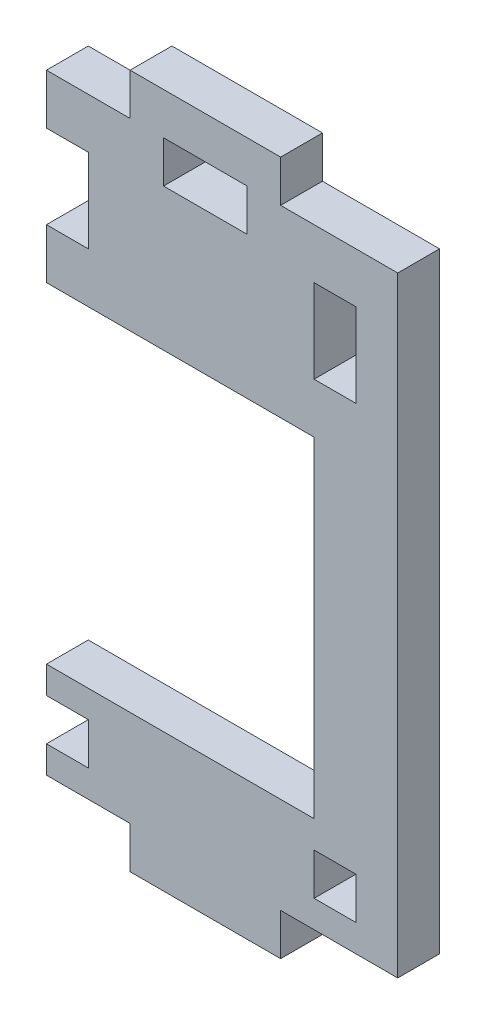
ISO-10303-21;
HEADER;
FILE_DESCRIPTION(('STEP AP214'),'2;1');
FILE_NAME('part.step','',(''),(''),'','','');
FILE_SCHEMA(('AUTOMOTIVE_DESIGN { 1 0 10303 214 1 1 1 1 }'));
ENDSEC;
DATA;
#1=APPLICATION_CONTEXT('core data for automotive mechanical design processes');
#2=APPLICATION_PROTOCOL_DEFINITION('international standard','automotive_design',2000,#1);
#3=PRODUCT_CONTEXT('',#1,'mechanical');
#4=PRODUCT('Part','Part','',(#3));
#5=PRODUCT_RELATED_PRODUCT_CATEGORY('part','',(#4));
#6=PRODUCT_DEFINITION_FORMATION('','',#4);
#7=PRODUCT_DEFINITION_CONTEXT('part definition',#1,'design');
#8=PRODUCT_DEFINITION('design','',#6,#7);
#9=PRODUCT_DEFINITION_SHAPE('','',#8);
#10=(LENGTH_UNIT() NAMED_UNIT(*) SI_UNIT(.MILLI.,.METRE.));
#11=(NAMED_UNIT(*) PLANE_ANGLE_UNIT() SI_UNIT($,.RADIAN.));
#12=(NAMED_UNIT(*) SI_UNIT($,.STERADIAN.) SOLID_ANGLE_UNIT());
#13=UNCERTAINTY_MEASURE_WITH_UNIT(LENGTH_MEASURE(1.E-05),#10,'distance_accuracy_value','');
#14=(GEOMETRIC_REPRESENTATION_CONTEXT(3) GLOBAL_UNCERTAINTY_ASSIGNED_CONTEXT((#13)) GLOBAL_UNIT_ASSIGNED_CONTEXT((#10,
#11,#12)) REPRESENTATION_CONTEXT('',''));
#15=CARTESIAN_POINT('',(0.,0.,0.));
#16=DIRECTION('',(0.,0.,1.));
#17=DIRECTION('',(1.,0.,0.));
#18=AXIS2_PLACEMENT_3D('',#15,#16,#17);
#19=CARTESIAN_POINT('',(42.,0.,5.));
#20=DIRECTION('',(0.,1.,0.));
#21=DIRECTION('',(0.,0.,1.));
#22=AXIS2_PLACEMENT_3D('',#19,#20,#21);
#23=PLANE('',#22);
#24=DIRECTION('',(0.,0.,1.));
#25=VECTOR('',#24,1.);
#26=CARTESIAN_POINT('',(28.,0.,0.));
#27=LINE('',#26,#25);
#28=CARTESIAN_POINT('',(28.,0.,0.));
#29=VERTEX_POINT('',#28);
#30=CARTESIAN_POINT('',(28.,0.,5.));
#31=VERTEX_POINT('',#30);
#32=EDGE_CURVE('E300',#29,#31,#27,.T.);
#33=ORIENTED_EDGE('',*,*,#32,.F.);
#34=DIRECTION('',(1.,0.,0.));
#35=VECTOR('',#34,1.);
#36=CARTESIAN_POINT('',(42.,0.,0.));
#37=LINE('',#36,#35);
#38=CARTESIAN_POINT('',(42.,0.,0.));
#39=VERTEX_POINT('',#38);
#40=EDGE_CURVE('E509',#29,#39,#37,.T.);
#41=ORIENTED_EDGE('',*,*,#40,.T.);
#42=DIRECTION('',(0.,0.,-1.));
#43=VECTOR('',#42,1.);
#44=CARTESIAN_POINT('',(42.,0.,5.));
#45=LINE('',#44,#43);
#46=CARTESIAN_POINT('',(42.,0.,5.));
#47=VERTEX_POINT('',#46);
#48=EDGE_CURVE('E531',#47,#39,#45,.T.);
#49=ORIENTED_EDGE('',*,*,#48,.F.);
#50=DIRECTION('',(1.,0.,0.));
#51=VECTOR('',#50,1.);
#52=CARTESIAN_POINT('',(42.,0.,5.));
#53=LINE('',#52,#51);
#54=EDGE_CURVE('E497',#31,#47,#53,.T.);
#55=ORIENTED_EDGE('',*,*,#54,.F.);
#56=EDGE_LOOP('',(#33,#41,#49,#55));
#57=FACE_BOUND('',#56,.T.);
#58=ADVANCED_FACE('F32',(#57),#23,.F.);
#59=CARTESIAN_POINT('',(0.,73.,5.));
#60=DIRECTION('',(0.,-1.,0.));
#61=DIRECTION('',(0.,0.,-1.));
#62=AXIS2_PLACEMENT_3D('',#59,#60,#61);
#63=PLANE('',#62);
#64=DIRECTION('',(-1.,0.,0.));
#65=VECTOR('',#64,1.);
#66=CARTESIAN_POINT('',(0.,73.,5.));
#67=LINE('',#66,#65);
#68=CARTESIAN_POINT('',(10.,73.,5.));
#69=VERTEX_POINT('',#68);
#70=CARTESIAN_POINT('',(0.,73.,5.));
#71=VERTEX_POINT('',#70);
#72=EDGE_CURVE('E565',#69,#71,#67,.T.);
#73=ORIENTED_EDGE('',*,*,#72,.F.);
#74=DIRECTION('',(0.,0.,1.));
#75=VECTOR('',#74,1.);
#76=CARTESIAN_POINT('',(10.,73.,0.));
#77=LINE('',#76,#75);
#78=CARTESIAN_POINT('',(10.,73.,0.));
#79=VERTEX_POINT('',#78);
#80=EDGE_CURVE('E321',#79,#69,#77,.T.);
#81=ORIENTED_EDGE('',*,*,#80,.F.);
#82=DIRECTION('',(-1.,0.,0.));
#83=VECTOR('',#82,1.);
#84=CARTESIAN_POINT('',(0.,73.,0.));
#85=LINE('',#84,#83);
#86=CARTESIAN_POINT('',(0.,73.,0.));
#87=VERTEX_POINT('',#86);
#88=EDGE_CURVE('E521',#79,#87,#85,.T.);
#89=ORIENTED_EDGE('',*,*,#88,.T.);
#90=DIRECTION('',(0.,0.,-1.));
#91=VECTOR('',#90,1.);
#92=CARTESIAN_POINT('',(0.,73.,5.));
#93=LINE('',#92,#91);
#94=EDGE_CURVE('E524',#71,#87,#93,.T.);
#95=ORIENTED_EDGE('',*,*,#94,.F.);
#96=EDGE_LOOP('',(#73,#81,#89,#95));
#97=FACE_BOUND('',#96,.T.);
#98=ADVANCED_FACE('F583',(#97),#63,.F.);
#99=CARTESIAN_POINT('',(0.,0.,5.));
#100=DIRECTION('',(1.,0.,0.));
#101=DIRECTION('',(0.,0.,-1.));
#102=AXIS2_PLACEMENT_3D('',#99,#100,#101);
#103=PLANE('',#102);
#104=DIRECTION('',(0.,-1.,0.));
#105=VECTOR('',#104,1.);
#106=CARTESIAN_POINT('',(0.,0.,0.));
#107=LINE('',#106,#105);
#108=CARTESIAN_POINT('',(0.,11.5,0.));
#109=VERTEX_POINT('',#108);
#110=CARTESIAN_POINT('',(0.,8.25,0.));
#111=VERTEX_POINT('',#110);
#112=EDGE_CURVE('E513',#109,#111,#107,.T.);
#113=ORIENTED_EDGE('',*,*,#112,.T.);
#114=DIRECTION('',(0.,0.,1.));
#115=VECTOR('',#114,1.);
#116=CARTESIAN_POINT('',(0.,8.25,0.));
#117=LINE('',#116,#115);
#118=CARTESIAN_POINT('',(0.,8.25,5.));
#119=VERTEX_POINT('',#118);
#120=EDGE_CURVE('E448',#111,#119,#117,.T.);
#121=ORIENTED_EDGE('',*,*,#120,.T.);
#122=DIRECTION('',(0.,-1.,0.));
#123=VECTOR('',#122,1.);
#124=CARTESIAN_POINT('',(0.,0.,5.));
#125=LINE('',#124,#123);
#126=CARTESIAN_POINT('',(0.,11.5,5.));
#127=VERTEX_POINT('',#126);
#128=EDGE_CURVE('E494',#127,#119,#125,.T.);
#129=ORIENTED_EDGE('',*,*,#128,.F.);
#130=DIRECTION('',(0.,0.,-1.));
#131=VECTOR('',#130,1.);
#132=CARTESIAN_POINT('',(0.,11.5,5.));
#133=LINE('',#132,#131);
#134=EDGE_CURVE('E537',#127,#109,#133,.T.);
#135=ORIENTED_EDGE('',*,*,#134,.T.);
#136=EDGE_LOOP('',(#113,#121,#129,#135));
#137=FACE_BOUND('',#136,.T.);
#138=ADVANCED_FACE('F593',(#137),#103,.F.);
#139=CARTESIAN_POINT('',(0.,51.,5.));
#140=DIRECTION('',(1.,0.,0.));
#141=DIRECTION('',(0.,0.,-1.));
#142=AXIS2_PLACEMENT_3D('',#139,#140,#141);
#143=PLANE('',#142);
#144=DIRECTION('',(0.,-1.,0.));
#145=VECTOR('',#144,1.);
#146=CARTESIAN_POINT('',(0.,51.,5.));
#147=LINE('',#146,#145);
#148=CARTESIAN_POINT('',(0.,57.,5.));
#149=VERTEX_POINT('',#148);
#150=CARTESIAN_POINT('',(0.,51.,5.));
#151=VERTEX_POINT('',#150);
#152=EDGE_CURVE('E487',#149,#151,#147,.T.);
#153=ORIENTED_EDGE('',*,*,#152,.F.);
#154=DIRECTION('',(0.,0.,1.));
#155=VECTOR('',#154,1.);
#156=CARTESIAN_POINT('',(0.,57.,0.));
#157=LINE('',#156,#155);
#158=CARTESIAN_POINT('',(0.,57.,0.));
#159=VERTEX_POINT('',#158);
#160=EDGE_CURVE('E477',#159,#149,#157,.T.);
#161=ORIENTED_EDGE('',*,*,#160,.F.);
#162=DIRECTION('',(0.,-1.,0.));
#163=VECTOR('',#162,1.);
#164=CARTESIAN_POINT('',(0.,51.,0.));
#165=LINE('',#164,#163);
#166=CARTESIAN_POINT('',(0.,51.,0.));
#167=VERTEX_POINT('',#166);
#168=EDGE_CURVE('E476',#159,#167,#165,.T.);
#169=ORIENTED_EDGE('',*,*,#168,.T.);
#170=DIRECTION('',(0.,0.,-1.));
#171=VECTOR('',#170,1.);
#172=CARTESIAN_POINT('',(0.,51.,5.));
#173=LINE('',#172,#171);
#174=EDGE_CURVE('E11',#151,#167,#173,.T.);
#175=ORIENTED_EDGE('',*,*,#174,.F.);
#176=EDGE_LOOP('',(#153,#161,#169,#175));
#177=FACE_BOUND('',#176,.T.);
#178=ADVANCED_FACE('F637',(#177),#143,.F.);
#179=CARTESIAN_POINT('',(0.,67.,0.));
#180=VERTEX_POINT('',#179);
#181=EDGE_CURVE('E561',#87,#180,#165,.T.);
#182=ORIENTED_EDGE('',*,*,#181,.T.);
#183=DIRECTION('',(0.,0.,1.));
#184=VECTOR('',#183,1.);
#185=CARTESIAN_POINT('',(0.,67.,0.));
#186=LINE('',#185,#184);
#187=CARTESIAN_POINT('',(0.,67.,5.));
#188=VERTEX_POINT('',#187);
#189=EDGE_CURVE('E479',#180,#188,#186,.T.);
#190=ORIENTED_EDGE('',*,*,#189,.T.);
#191=EDGE_CURVE('E483',#71,#188,#147,.T.);
#192=ORIENTED_EDGE('',*,*,#191,.F.);
#193=ORIENTED_EDGE('',*,*,#94,.T.);
#194=EDGE_LOOP('',(#182,#190,#192,#193));
#195=FACE_BOUND('',#194,.T.);
#196=ADVANCED_FACE('F34',(#195),#143,.F.);
#197=CARTESIAN_POINT('',(32.,51.,5.));
#198=DIRECTION('',(0.,1.,0.));
#199=DIRECTION('',(-1.,0.,0.));
#200=AXIS2_PLACEMENT_3D('',#197,#198,#199);
#201=PLANE('',#200);
#202=DIRECTION('',(1.,0.,0.));
#203=VECTOR('',#202,1.);
#204=CARTESIAN_POINT('',(32.,51.,0.));
#205=LINE('',#204,#203);
#206=CARTESIAN_POINT('',(32.,51.,0.));
#207=VERTEX_POINT('',#206);
#208=EDGE_CURVE('E556',#167,#207,#205,.T.);
#209=ORIENTED_EDGE('',*,*,#208,.T.);
#210=DIRECTION('',(0.,0.,-1.));
#211=VECTOR('',#210,1.);
#212=CARTESIAN_POINT('',(32.,51.,5.));
#213=LINE('',#212,#211);
#214=CARTESIAN_POINT('',(32.,51.,5.));
#215=VERTEX_POINT('',#214);
#216=EDGE_CURVE('E41',#215,#207,#213,.T.);
#217=ORIENTED_EDGE('',*,*,#216,.F.);
#218=DIRECTION('',(1.,0.,0.));
#219=VECTOR('',#218,1.);
#220=CARTESIAN_POINT('',(32.,51.,5.));
#221=LINE('',#220,#219);
#222=EDGE_CURVE('E486',#151,#215,#221,.T.);
#223=ORIENTED_EDGE('',*,*,#222,.F.);
#224=ORIENTED_EDGE('',*,*,#174,.T.);
#225=EDGE_LOOP('',(#209,#217,#223,#224));
#226=FACE_BOUND('',#225,.T.);
#227=ADVANCED_FACE('F631',(#226),#201,.F.);
#228=CARTESIAN_POINT('',(32.,11.5,5.));
#229=DIRECTION('',(1.,0.,0.));
#230=DIRECTION('',(0.,0.,-1.));
#231=AXIS2_PLACEMENT_3D('',#228,#229,#230);
#232=PLANE('',#231);
#233=DIRECTION('',(0.,-1.,0.));
#234=VECTOR('',#233,1.);
#235=CARTESIAN_POINT('',(32.,11.5,0.));
#236=LINE('',#235,#234);
#237=CARTESIAN_POINT('',(32.,11.5,0.));
#238=VERTEX_POINT('',#237);
#239=EDGE_CURVE('E550',#207,#238,#236,.T.);
#240=ORIENTED_EDGE('',*,*,#239,.T.);
#241=DIRECTION('',(0.,0.,-1.));
#242=VECTOR('',#241,1.);
#243=CARTESIAN_POINT('',(32.,11.5,5.));
#244=LINE('',#243,#242);
#245=CARTESIAN_POINT('',(32.,11.5,5.));
#246=VERTEX_POINT('',#245);
#247=EDGE_CURVE('E540',#246,#238,#244,.T.);
#248=ORIENTED_EDGE('',*,*,#247,.F.);
#249=DIRECTION('',(0.,-1.,0.));
#250=VECTOR('',#249,1.);
#251=CARTESIAN_POINT('',(32.,11.5,5.));
#252=LINE('',#251,#250);
#253=EDGE_CURVE('E489',#215,#246,#252,.T.);
#254=ORIENTED_EDGE('',*,*,#253,.F.);
#255=ORIENTED_EDGE('',*,*,#216,.T.);
#256=EDGE_LOOP('',(#240,#248,#254,#255));
#257=FACE_BOUND('',#256,.T.);
#258=ADVANCED_FACE('F548',(#257),#232,.F.);
#259=CARTESIAN_POINT('',(0.,11.5,5.));
#260=DIRECTION('',(0.,-1.,0.));
#261=DIRECTION('',(0.,0.,-1.));
#262=AXIS2_PLACEMENT_3D('',#259,#260,#261);
#263=PLANE('',#262);
#264=DIRECTION('',(-1.,0.,0.));
#265=VECTOR('',#264,1.);
#266=CARTESIAN_POINT('',(0.,11.5,0.));
#267=LINE('',#266,#265);
#268=EDGE_CURVE('E558',#238,#109,#267,.T.);
#269=ORIENTED_EDGE('',*,*,#268,.T.);
#270=ORIENTED_EDGE('',*,*,#134,.F.);
#271=DIRECTION('',(-1.,0.,0.));
#272=VECTOR('',#271,1.);
#273=CARTESIAN_POINT('',(0.,11.5,5.));
#274=LINE('',#273,#272);
#275=EDGE_CURVE('E491',#246,#127,#274,.T.);
#276=ORIENTED_EDGE('',*,*,#275,.F.);
#277=ORIENTED_EDGE('',*,*,#247,.T.);
#278=EDGE_LOOP('',(#269,#270,#276,#277));
#279=FACE_BOUND('',#278,.T.);
#280=ADVANCED_FACE('F608',(#279),#263,.F.);
#281=CARTESIAN_POINT('',(0.,3.25,5.));
#282=VERTEX_POINT('',#281);
#283=CARTESIAN_POINT('',(0.,0.,5.));
#284=VERTEX_POINT('',#283);
#285=EDGE_CURVE('E493',#282,#284,#125,.T.);
#286=ORIENTED_EDGE('',*,*,#285,.F.);
#287=DIRECTION('',(0.,0.,1.));
#288=VECTOR('',#287,1.);
#289=CARTESIAN_POINT('',(0.,3.25,0.));
#290=LINE('',#289,#288);
#291=CARTESIAN_POINT('',(0.,3.25,0.));
#292=VERTEX_POINT('',#291);
#293=EDGE_CURVE('E441',#292,#282,#290,.T.);
#294=ORIENTED_EDGE('',*,*,#293,.F.);
#295=CARTESIAN_POINT('',(0.,0.,0.));
#296=VERTEX_POINT('',#295);
#297=EDGE_CURVE('E560',#292,#296,#107,.T.);
#298=ORIENTED_EDGE('',*,*,#297,.T.);
#299=DIRECTION('',(0.,0.,-1.));
#300=VECTOR('',#299,1.);
#301=CARTESIAN_POINT('',(0.,0.,5.));
#302=LINE('',#301,#300);
#303=EDGE_CURVE('E534',#284,#296,#302,.T.);
#304=ORIENTED_EDGE('',*,*,#303,.F.);
#305=EDGE_LOOP('',(#286,#294,#298,#304));
#306=FACE_BOUND('',#305,.T.);
#307=ADVANCED_FACE('F603',(#306),#103,.F.);
#308=CARTESIAN_POINT('',(10.,0.,0.));
#309=VERTEX_POINT('',#308);
#310=EDGE_CURVE('E512',#296,#309,#37,.T.);
#311=ORIENTED_EDGE('',*,*,#310,.T.);
#312=DIRECTION('',(0.,0.,1.));
#313=VECTOR('',#312,1.);
#314=CARTESIAN_POINT('',(10.,0.,0.));
#315=LINE('',#314,#313);
#316=CARTESIAN_POINT('',(10.,0.,5.));
#317=VERTEX_POINT('',#316);
#318=EDGE_CURVE('E290',#309,#317,#315,.T.);
#319=ORIENTED_EDGE('',*,*,#318,.T.);
#320=EDGE_CURVE('E506',#284,#317,#53,.T.);
#321=ORIENTED_EDGE('',*,*,#320,.F.);
#322=ORIENTED_EDGE('',*,*,#303,.T.);
#323=EDGE_LOOP('',(#311,#319,#321,#322));
#324=FACE_BOUND('',#323,.T.);
#325=ADVANCED_FACE('F589',(#324),#23,.F.);
#326=CARTESIAN_POINT('',(42.,73.,5.));
#327=DIRECTION('',(-1.,0.,0.));
#328=DIRECTION('',(0.,-1.,0.));
#329=AXIS2_PLACEMENT_3D('',#326,#327,#328);
#330=PLANE('',#329);
#331=DIRECTION('',(0.,1.,0.));
#332=VECTOR('',#331,1.);
#333=CARTESIAN_POINT('',(42.,73.,0.));
#334=LINE('',#333,#332);
#335=CARTESIAN_POINT('',(42.,73.,0.));
#336=VERTEX_POINT('',#335);
#337=EDGE_CURVE('E518',#39,#336,#334,.T.);
#338=ORIENTED_EDGE('',*,*,#337,.T.);
#339=DIRECTION('',(0.,0.,-1.));
#340=VECTOR('',#339,1.);
#341=CARTESIAN_POINT('',(42.,73.,5.));
#342=LINE('',#341,#340);
#343=CARTESIAN_POINT('',(42.,73.,5.));
#344=VERTEX_POINT('',#343);
#345=EDGE_CURVE('E527',#344,#336,#342,.T.);
#346=ORIENTED_EDGE('',*,*,#345,.F.);
#347=DIRECTION('',(0.,1.,0.));
#348=VECTOR('',#347,1.);
#349=CARTESIAN_POINT('',(42.,73.,5.));
#350=LINE('',#349,#348);
#351=EDGE_CURVE('E500',#47,#344,#350,.T.);
#352=ORIENTED_EDGE('',*,*,#351,.F.);
#353=ORIENTED_EDGE('',*,*,#48,.T.);
#354=EDGE_LOOP('',(#338,#346,#352,#353));
#355=FACE_BOUND('',#354,.T.);
#356=ADVANCED_FACE('F577',(#355),#330,.F.);
#357=CARTESIAN_POINT('',(28.,73.,0.));
#358=VERTEX_POINT('',#357);
#359=EDGE_CURVE('E522',#336,#358,#85,.T.);
#360=ORIENTED_EDGE('',*,*,#359,.T.);
#361=DIRECTION('',(0.,0.,1.));
#362=VECTOR('',#361,1.);
#363=CARTESIAN_POINT('',(28.,73.,0.));
#364=LINE('',#363,#362);
#365=CARTESIAN_POINT('',(28.,73.,5.));
#366=VERTEX_POINT('',#365);
#367=EDGE_CURVE('E57',#358,#366,#364,.T.);
#368=ORIENTED_EDGE('',*,*,#367,.T.);
#369=EDGE_CURVE('E528',#344,#366,#67,.T.);
#370=ORIENTED_EDGE('',*,*,#369,.F.);
#371=ORIENTED_EDGE('',*,*,#345,.T.);
#372=EDGE_LOOP('',(#360,#368,#370,#371));
#373=FACE_BOUND('',#372,.T.);
#374=ADVANCED_FACE('F580',(#373),#63,.F.);
#375=CARTESIAN_POINT('',(0.,0.,5.));
#376=DIRECTION('',(0.,0.,-1.));
#377=DIRECTION('',(-1.,0.,0.));
#378=AXIS2_PLACEMENT_3D('',#375,#376,#377);
#379=PLANE('',#378);
#380=ORIENTED_EDGE('',*,*,#369,.T.);
#381=DIRECTION('',(0.,1.,0.));
#382=VECTOR('',#381,1.);
#383=CARTESIAN_POINT('',(28.,73.,5.));
#384=LINE('',#383,#382);
#385=CARTESIAN_POINT('',(28.,78.,5.));
#386=VERTEX_POINT('',#385);
#387=EDGE_CURVE('E328',#366,#386,#384,.T.);
#388=ORIENTED_EDGE('',*,*,#387,.T.);
#389=DIRECTION('',(-1.,0.,0.));
#390=VECTOR('',#389,1.);
#391=CARTESIAN_POINT('',(10.,78.,5.));
#392=LINE('',#391,#390);
#393=CARTESIAN_POINT('',(10.,78.,5.));
#394=VERTEX_POINT('',#393);
#395=EDGE_CURVE('E312',#386,#394,#392,.T.);
#396=ORIENTED_EDGE('',*,*,#395,.T.);
#397=DIRECTION('',(0.,-1.,0.));
#398=VECTOR('',#397,1.);
#399=CARTESIAN_POINT('',(10.,73.,5.));
#400=LINE('',#399,#398);
#401=EDGE_CURVE('E322',#394,#69,#400,.T.);
#402=ORIENTED_EDGE('',*,*,#401,.T.);
#403=ORIENTED_EDGE('',*,*,#72,.T.);
#404=ORIENTED_EDGE('',*,*,#191,.T.);
#405=DIRECTION('',(-1.,0.,0.));
#406=VECTOR('',#405,1.);
#407=CARTESIAN_POINT('',(4.99999999999999,67.,5.));
#408=LINE('',#407,#406);
#409=CARTESIAN_POINT('',(4.99999999999999,67.,5.));
#410=VERTEX_POINT('',#409);
#411=EDGE_CURVE('E470',#410,#188,#408,.T.);
#412=ORIENTED_EDGE('',*,*,#411,.F.);
#413=DIRECTION('',(0.,1.,0.));
#414=VECTOR('',#413,1.);
#415=CARTESIAN_POINT('',(4.99999999999999,67.,5.));
#416=LINE('',#415,#414);
#417=CARTESIAN_POINT('',(4.99999999999999,57.,5.));
#418=VERTEX_POINT('',#417);
#419=EDGE_CURVE('E451',#418,#410,#416,.T.);
#420=ORIENTED_EDGE('',*,*,#419,.F.);
#421=DIRECTION('',(1.,0.,0.));
#422=VECTOR('',#421,1.);
#423=CARTESIAN_POINT('',(4.99999999999999,57.,5.));
#424=LINE('',#423,#422);
#425=EDGE_CURVE('E461',#149,#418,#424,.T.);
#426=ORIENTED_EDGE('',*,*,#425,.F.);
#427=ORIENTED_EDGE('',*,*,#152,.T.);
#428=ORIENTED_EDGE('',*,*,#222,.T.);
#429=ORIENTED_EDGE('',*,*,#253,.T.);
#430=ORIENTED_EDGE('',*,*,#275,.T.);
#431=ORIENTED_EDGE('',*,*,#128,.T.);
#432=DIRECTION('',(-1.,0.,0.));
#433=VECTOR('',#432,1.);
#434=CARTESIAN_POINT('',(0.,8.25,5.));
#435=LINE('',#434,#433);
#436=CARTESIAN_POINT('',(4.99999999999999,8.25,5.));
#437=VERTEX_POINT('',#436);
#438=EDGE_CURVE('E435',#437,#119,#435,.T.);
#439=ORIENTED_EDGE('',*,*,#438,.F.);
#440=DIRECTION('',(0.,1.,0.));
#441=VECTOR('',#440,1.);
#442=CARTESIAN_POINT('',(4.99999999999999,8.25,5.));
#443=LINE('',#442,#441);
#444=CARTESIAN_POINT('',(4.99999999999999,3.25,5.));
#445=VERTEX_POINT('',#444);
#446=EDGE_CURVE('E444',#445,#437,#443,.T.);
#447=ORIENTED_EDGE('',*,*,#446,.F.);
#448=DIRECTION('',(1.,0.,0.));
#449=VECTOR('',#448,1.);
#450=CARTESIAN_POINT('',(0.,3.25,5.));
#451=LINE('',#450,#449);
#452=EDGE_CURVE('E424',#282,#445,#451,.T.);
#453=ORIENTED_EDGE('',*,*,#452,.F.);
#454=ORIENTED_EDGE('',*,*,#285,.T.);
#455=ORIENTED_EDGE('',*,*,#320,.T.);
#456=DIRECTION('',(0.,-1.,0.));
#457=VECTOR('',#456,1.);
#458=CARTESIAN_POINT('',(10.,0.,5.));
#459=LINE('',#458,#457);
#460=CARTESIAN_POINT('',(10.,-5.00000000000002,5.));
#461=VERTEX_POINT('',#460);
#462=EDGE_CURVE('E49',#317,#461,#459,.T.);
#463=ORIENTED_EDGE('',*,*,#462,.T.);
#464=DIRECTION('',(1.,0.,0.));
#465=VECTOR('',#464,1.);
#466=CARTESIAN_POINT('',(10.,-5.00000000000002,5.));
#467=LINE('',#466,#465);
#468=CARTESIAN_POINT('',(28.,-5.00000000000002,5.));
#469=VERTEX_POINT('',#468);
#470=EDGE_CURVE('E273',#461,#469,#467,.T.);
#471=ORIENTED_EDGE('',*,*,#470,.T.);
#472=DIRECTION('',(0.,1.,0.));
#473=VECTOR('',#472,1.);
#474=CARTESIAN_POINT('',(28.,0.,5.));
#475=LINE('',#474,#473);
#476=EDGE_CURVE('E291',#469,#31,#475,.T.);
#477=ORIENTED_EDGE('',*,*,#476,.T.);
#478=ORIENTED_EDGE('',*,*,#54,.T.);
#479=ORIENTED_EDGE('',*,*,#351,.T.);
#480=EDGE_LOOP('',(#380,#388,#396,#402,#403,#404,#412,#420,#426,#427,#428,#429,#430,#431,#439,
#447,#453,#454,#455,#463,#471,#477,#478,#479));
#481=FACE_BOUND('',#480,.T.);
#482=DIRECTION('',(1.,0.,0.));
#483=VECTOR('',#482,1.);
#484=CARTESIAN_POINT('',(32.,3.25,5.));
#485=LINE('',#484,#483);
#486=CARTESIAN_POINT('',(32.,3.25,5.));
#487=VERTEX_POINT('',#486);
#488=CARTESIAN_POINT('',(37.,3.25,5.));
#489=VERTEX_POINT('',#488);
#490=EDGE_CURVE('E382',#487,#489,#485,.T.);
#491=ORIENTED_EDGE('',*,*,#490,.F.);
#492=DIRECTION('',(0.,-1.,0.));
#493=VECTOR('',#492,1.);
#494=CARTESIAN_POINT('',(32.,8.25,5.));
#495=LINE('',#494,#493);
#496=CARTESIAN_POINT('',(32.,8.25,5.));
#497=VERTEX_POINT('',#496);
#498=EDGE_CURVE('E360',#497,#487,#495,.T.);
#499=ORIENTED_EDGE('',*,*,#498,.F.);
#500=DIRECTION('',(-1.,0.,0.));
#501=VECTOR('',#500,1.);
#502=CARTESIAN_POINT('',(32.,8.25,5.));
#503=LINE('',#502,#501);
#504=CARTESIAN_POINT('',(37.,8.25,5.));
#505=VERTEX_POINT('',#504);
#506=EDGE_CURVE('E371',#505,#497,#503,.T.);
#507=ORIENTED_EDGE('',*,*,#506,.F.);
#508=DIRECTION('',(0.,1.,0.));
#509=VECTOR('',#508,1.);
#510=CARTESIAN_POINT('',(37.,8.25,5.));
#511=LINE('',#510,#509);
#512=EDGE_CURVE('E385',#489,#505,#511,.T.);
#513=ORIENTED_EDGE('',*,*,#512,.F.);
#514=EDGE_LOOP('',(#491,#499,#507,#513));
#515=FACE_BOUND('',#514,.T.);
#516=DIRECTION('',(1.,0.,0.));
#517=VECTOR('',#516,1.);
#518=CARTESIAN_POINT('',(32.,57.,5.));
#519=LINE('',#518,#517);
#520=CARTESIAN_POINT('',(32.,57.,5.));
#521=VERTEX_POINT('',#520);
#522=CARTESIAN_POINT('',(37.,57.,5.));
#523=VERTEX_POINT('',#522);
#524=EDGE_CURVE('E414',#521,#523,#519,.T.);
#525=ORIENTED_EDGE('',*,*,#524,.F.);
#526=DIRECTION('',(0.,-1.,0.));
#527=VECTOR('',#526,1.);
#528=CARTESIAN_POINT('',(32.,67.,5.));
#529=LINE('',#528,#527);
#530=CARTESIAN_POINT('',(32.,67.,5.));
#531=VERTEX_POINT('',#530);
#532=EDGE_CURVE('E392',#531,#521,#529,.T.);
#533=ORIENTED_EDGE('',*,*,#532,.F.);
#534=DIRECTION('',(-1.,0.,0.));
#535=VECTOR('',#534,1.);
#536=CARTESIAN_POINT('',(32.,67.,5.));
#537=LINE('',#536,#535);
#538=CARTESIAN_POINT('',(37.,67.,5.));
#539=VERTEX_POINT('',#538);
#540=EDGE_CURVE('E403',#539,#531,#537,.T.);
#541=ORIENTED_EDGE('',*,*,#540,.F.);
#542=DIRECTION('',(0.,1.,0.));
#543=VECTOR('',#542,1.);
#544=CARTESIAN_POINT('',(37.,67.,5.));
#545=LINE('',#544,#543);
#546=EDGE_CURVE('E417',#523,#539,#545,.T.);
#547=ORIENTED_EDGE('',*,*,#546,.F.);
#548=EDGE_LOOP('',(#525,#533,#541,#547));
#549=FACE_BOUND('',#548,.T.);
#550=DIRECTION('',(1.,0.,0.));
#551=VECTOR('',#550,1.);
#552=CARTESIAN_POINT('',(14.000000000002,67.9999999999999,5.));
#553=LINE('',#552,#551);
#554=CARTESIAN_POINT('',(14.000000000002,67.9999999999999,5.));
#555=VERTEX_POINT('',#554);
#556=CARTESIAN_POINT('',(24.000000000002,67.9999999999999,5.));
#557=VERTEX_POINT('',#556);
#558=EDGE_CURVE('E353',#555,#557,#553,.T.);
#559=ORIENTED_EDGE('',*,*,#558,.F.);
#560=DIRECTION('',(0.,-1.,0.));
#561=VECTOR('',#560,1.);
#562=CARTESIAN_POINT('',(14.000000000002,73.,5.));
#563=LINE('',#562,#561);
#564=CARTESIAN_POINT('',(14.000000000002,73.,5.));
#565=VERTEX_POINT('',#564);
#566=EDGE_CURVE('E335',#565,#555,#563,.T.);
#567=ORIENTED_EDGE('',*,*,#566,.F.);
#568=DIRECTION('',(1.,0.,0.));
#569=VECTOR('',#568,1.);
#570=CARTESIAN_POINT('',(10.,73.,5.));
#571=LINE('',#570,#569);
#572=CARTESIAN_POINT('',(24.000000000002,73.,5.));
#573=VERTEX_POINT('',#572);
#574=EDGE_CURVE('E325',#565,#573,#571,.T.);
#575=ORIENTED_EDGE('',*,*,#574,.T.);
#576=DIRECTION('',(0.,1.,0.));
#577=VECTOR('',#576,1.);
#578=CARTESIAN_POINT('',(24.000000000002,73.,5.));
#579=LINE('',#578,#577);
#580=EDGE_CURVE('E344',#557,#573,#579,.T.);
#581=ORIENTED_EDGE('',*,*,#580,.F.);
#582=EDGE_LOOP('',(#559,#567,#575,#581));
#583=FACE_BOUND('',#582,.T.);
#584=ADVANCED_FACE('F572',(#481,#515,#549,#583),#379,.F.);
#585=CARTESIAN_POINT('',(0.,0.,0.));
#586=DIRECTION('',(0.,0.,-1.));
#587=DIRECTION('',(-1.,0.,0.));
#588=AXIS2_PLACEMENT_3D('',#585,#586,#587);
#589=PLANE('',#588);
#590=DIRECTION('',(0.,1.,0.));
#591=VECTOR('',#590,1.);
#592=CARTESIAN_POINT('',(28.,73.,0.));
#593=LINE('',#592,#591);
#594=CARTESIAN_POINT('',(28.,78.,0.));
#595=VERTEX_POINT('',#594);
#596=EDGE_CURVE('E315',#358,#595,#593,.T.);
#597=ORIENTED_EDGE('',*,*,#596,.F.);
#598=ORIENTED_EDGE('',*,*,#359,.F.);
#599=ORIENTED_EDGE('',*,*,#337,.F.);
#600=ORIENTED_EDGE('',*,*,#40,.F.);
#601=DIRECTION('',(0.,1.,0.));
#602=VECTOR('',#601,1.);
#603=CARTESIAN_POINT('',(28.,0.,0.));
#604=LINE('',#603,#602);
#605=CARTESIAN_POINT('',(28.,-5.00000000000002,0.));
#606=VERTEX_POINT('',#605);
#607=EDGE_CURVE('E276',#606,#29,#604,.T.);
#608=ORIENTED_EDGE('',*,*,#607,.F.);
#609=DIRECTION('',(1.,0.,0.));
#610=VECTOR('',#609,1.);
#611=CARTESIAN_POINT('',(10.,-5.00000000000002,0.));
#612=LINE('',#611,#610);
#613=CARTESIAN_POINT('',(10.,-5.00000000000002,0.));
#614=VERTEX_POINT('',#613);
#615=EDGE_CURVE('E271',#614,#606,#612,.T.);
#616=ORIENTED_EDGE('',*,*,#615,.F.);
#617=DIRECTION('',(0.,-1.,0.));
#618=VECTOR('',#617,1.);
#619=CARTESIAN_POINT('',(10.,0.,0.));
#620=LINE('',#619,#618);
#621=EDGE_CURVE('E285',#309,#614,#620,.T.);
#622=ORIENTED_EDGE('',*,*,#621,.F.);
#623=ORIENTED_EDGE('',*,*,#310,.F.);
#624=ORIENTED_EDGE('',*,*,#297,.F.);
#625=DIRECTION('',(1.,0.,0.));
#626=VECTOR('',#625,1.);
#627=CARTESIAN_POINT('',(0.,3.25,0.));
#628=LINE('',#627,#626);
#629=CARTESIAN_POINT('',(4.99999999999999,3.25,0.));
#630=VERTEX_POINT('',#629);
#631=EDGE_CURVE('E431',#292,#630,#628,.T.);
#632=ORIENTED_EDGE('',*,*,#631,.T.);
#633=DIRECTION('',(0.,1.,0.));
#634=VECTOR('',#633,1.);
#635=CARTESIAN_POINT('',(4.99999999999999,8.25,0.));
#636=LINE('',#635,#634);
#637=CARTESIAN_POINT('',(4.99999999999999,8.25,0.));
#638=VERTEX_POINT('',#637);
#639=EDGE_CURVE('E434',#630,#638,#636,.T.);
#640=ORIENTED_EDGE('',*,*,#639,.T.);
#641=DIRECTION('',(-1.,0.,0.));
#642=VECTOR('',#641,1.);
#643=CARTESIAN_POINT('',(0.,8.25,0.));
#644=LINE('',#643,#642);
#645=EDGE_CURVE('E438',#638,#111,#644,.T.);
#646=ORIENTED_EDGE('',*,*,#645,.T.);
#647=ORIENTED_EDGE('',*,*,#112,.F.);
#648=ORIENTED_EDGE('',*,*,#268,.F.);
#649=ORIENTED_EDGE('',*,*,#239,.F.);
#650=ORIENTED_EDGE('',*,*,#208,.F.);
#651=ORIENTED_EDGE('',*,*,#168,.F.);
#652=DIRECTION('',(1.,0.,0.));
#653=VECTOR('',#652,1.);
#654=CARTESIAN_POINT('',(4.99999999999999,57.,0.));
#655=LINE('',#654,#653);
#656=CARTESIAN_POINT('',(4.99999999999999,57.,0.));
#657=VERTEX_POINT('',#656);
#658=EDGE_CURVE('E464',#159,#657,#655,.T.);
#659=ORIENTED_EDGE('',*,*,#658,.T.);
#660=DIRECTION('',(0.,1.,0.));
#661=VECTOR('',#660,1.);
#662=CARTESIAN_POINT('',(4.99999999999999,67.,0.));
#663=LINE('',#662,#661);
#664=CARTESIAN_POINT('',(4.99999999999999,67.,0.));
#665=VERTEX_POINT('',#664);
#666=EDGE_CURVE('E457',#657,#665,#663,.T.);
#667=ORIENTED_EDGE('',*,*,#666,.T.);
#668=DIRECTION('',(-1.,0.,0.));
#669=VECTOR('',#668,1.);
#670=CARTESIAN_POINT('',(4.99999999999999,67.,0.));
#671=LINE('',#670,#669);
#672=EDGE_CURVE('E460',#665,#180,#671,.T.);
#673=ORIENTED_EDGE('',*,*,#672,.T.);
#674=ORIENTED_EDGE('',*,*,#181,.F.);
#675=ORIENTED_EDGE('',*,*,#88,.F.);
#676=DIRECTION('',(0.,-1.,0.));
#677=VECTOR('',#676,1.);
#678=CARTESIAN_POINT('',(10.,73.,0.));
#679=LINE('',#678,#677);
#680=CARTESIAN_POINT('',(10.,78.,0.));
#681=VERTEX_POINT('',#680);
#682=EDGE_CURVE('E309',#681,#79,#679,.T.);
#683=ORIENTED_EDGE('',*,*,#682,.F.);
#684=DIRECTION('',(-1.,0.,0.));
#685=VECTOR('',#684,1.);
#686=CARTESIAN_POINT('',(10.,78.,0.));
#687=LINE('',#686,#685);
#688=EDGE_CURVE('E318',#595,#681,#687,.T.);
#689=ORIENTED_EDGE('',*,*,#688,.F.);
#690=EDGE_LOOP('',(#597,#598,#599,#600,#608,#616,#622,#623,#624,#632,#640,#646,#647,#648,#649,
#650,#651,#659,#667,#673,#674,#675,#683,#689));
#691=FACE_BOUND('',#690,.T.);
#692=DIRECTION('',(0.,-1.,0.));
#693=VECTOR('',#692,1.);
#694=CARTESIAN_POINT('',(14.000000000002,73.,0.));
#695=LINE('',#694,#693);
#696=CARTESIAN_POINT('',(14.000000000002,73.,0.));
#697=VERTEX_POINT('',#696);
#698=CARTESIAN_POINT('',(14.000000000002,67.9999999999999,0.));
#699=VERTEX_POINT('',#698);
#700=EDGE_CURVE('E340',#697,#699,#695,.T.);
#701=ORIENTED_EDGE('',*,*,#700,.T.);
#702=DIRECTION('',(1.,0.,0.));
#703=VECTOR('',#702,1.);
#704=CARTESIAN_POINT('',(14.000000000002,67.9999999999999,0.));
#705=LINE('',#704,#703);
#706=CARTESIAN_POINT('',(24.000000000002,67.9999999999999,0.));
#707=VERTEX_POINT('',#706);
#708=EDGE_CURVE('E343',#699,#707,#705,.T.);
#709=ORIENTED_EDGE('',*,*,#708,.T.);
#710=DIRECTION('',(0.,1.,0.));
#711=VECTOR('',#710,1.);
#712=CARTESIAN_POINT('',(24.000000000002,73.,0.));
#713=LINE('',#712,#711);
#714=CARTESIAN_POINT('',(24.000000000002,73.,0.));
#715=VERTEX_POINT('',#714);
#716=EDGE_CURVE('E347',#707,#715,#713,.T.);
#717=ORIENTED_EDGE('',*,*,#716,.T.);
#718=DIRECTION('',(1.,0.,0.));
#719=VECTOR('',#718,1.);
#720=CARTESIAN_POINT('',(10.,73.,0.));
#721=LINE('',#720,#719);
#722=EDGE_CURVE('E311',#697,#715,#721,.T.);
#723=ORIENTED_EDGE('',*,*,#722,.F.);
#724=EDGE_LOOP('',(#701,#709,#717,#723));
#725=FACE_BOUND('',#724,.T.);
#726=DIRECTION('',(0.,-1.,0.));
#727=VECTOR('',#726,1.);
#728=CARTESIAN_POINT('',(32.,8.25,0.));
#729=LINE('',#728,#727);
#730=CARTESIAN_POINT('',(32.,8.25,0.));
#731=VERTEX_POINT('',#730);
#732=CARTESIAN_POINT('',(32.,3.25,0.));
#733=VERTEX_POINT('',#732);
#734=EDGE_CURVE('E367',#731,#733,#729,.T.);
#735=ORIENTED_EDGE('',*,*,#734,.T.);
#736=DIRECTION('',(1.,0.,0.));
#737=VECTOR('',#736,1.);
#738=CARTESIAN_POINT('',(32.,3.25,0.));
#739=LINE('',#738,#737);
#740=CARTESIAN_POINT('',(37.,3.25,0.));
#741=VERTEX_POINT('',#740);
#742=EDGE_CURVE('E370',#733,#741,#739,.T.);
#743=ORIENTED_EDGE('',*,*,#742,.T.);
#744=DIRECTION('',(0.,1.,0.));
#745=VECTOR('',#744,1.);
#746=CARTESIAN_POINT('',(37.,8.25,0.));
#747=LINE('',#746,#745);
#748=CARTESIAN_POINT('',(37.,8.25,0.));
#749=VERTEX_POINT('',#748);
#750=EDGE_CURVE('E374',#741,#749,#747,.T.);
#751=ORIENTED_EDGE('',*,*,#750,.T.);
#752=DIRECTION('',(-1.,0.,0.));
#753=VECTOR('',#752,1.);
#754=CARTESIAN_POINT('',(32.,8.25,0.));
#755=LINE('',#754,#753);
#756=EDGE_CURVE('E377',#749,#731,#755,.T.);
#757=ORIENTED_EDGE('',*,*,#756,.T.);
#758=EDGE_LOOP('',(#735,#743,#751,#757));
#759=FACE_BOUND('',#758,.T.);
#760=DIRECTION('',(0.,-1.,0.));
#761=VECTOR('',#760,1.);
#762=CARTESIAN_POINT('',(32.,67.,0.));
#763=LINE('',#762,#761);
#764=CARTESIAN_POINT('',(32.,67.,0.));
#765=VERTEX_POINT('',#764);
#766=CARTESIAN_POINT('',(32.,57.,0.));
#767=VERTEX_POINT('',#766);
#768=EDGE_CURVE('E399',#765,#767,#763,.T.);
#769=ORIENTED_EDGE('',*,*,#768,.T.);
#770=DIRECTION('',(1.,0.,0.));
#771=VECTOR('',#770,1.);
#772=CARTESIAN_POINT('',(32.,57.,0.));
#773=LINE('',#772,#771);
#774=CARTESIAN_POINT('',(37.,57.,0.));
#775=VERTEX_POINT('',#774);
#776=EDGE_CURVE('E402',#767,#775,#773,.T.);
#777=ORIENTED_EDGE('',*,*,#776,.T.);
#778=DIRECTION('',(0.,1.,0.));
#779=VECTOR('',#778,1.);
#780=CARTESIAN_POINT('',(37.,67.,0.));
#781=LINE('',#780,#779);
#782=CARTESIAN_POINT('',(37.,67.,0.));
#783=VERTEX_POINT('',#782);
#784=EDGE_CURVE('E406',#775,#783,#781,.T.);
#785=ORIENTED_EDGE('',*,*,#784,.T.);
#786=DIRECTION('',(-1.,0.,0.));
#787=VECTOR('',#786,1.);
#788=CARTESIAN_POINT('',(32.,67.,0.));
#789=LINE('',#788,#787);
#790=EDGE_CURVE('E409',#783,#765,#789,.T.);
#791=ORIENTED_EDGE('',*,*,#790,.T.);
#792=EDGE_LOOP('',(#769,#777,#785,#791));
#793=FACE_BOUND('',#792,.T.);
#794=ADVANCED_FACE('F282',(#691,#725,#759,#793),#589,.T.);
#795=CARTESIAN_POINT('',(4.99999999999999,67.,0.));
#796=DIRECTION('',(1.,0.,0.));
#797=DIRECTION('',(0.,1.,0.));
#798=AXIS2_PLACEMENT_3D('',#795,#796,#797);
#799=PLANE('',#798);
#800=ORIENTED_EDGE('',*,*,#419,.T.);
#801=DIRECTION('',(0.,0.,1.));
#802=VECTOR('',#801,1.);
#803=CARTESIAN_POINT('',(4.99999999999999,67.,0.));
#804=LINE('',#803,#802);
#805=EDGE_CURVE('E467',#665,#410,#804,.T.);
#806=ORIENTED_EDGE('',*,*,#805,.F.);
#807=ORIENTED_EDGE('',*,*,#666,.F.);
#808=DIRECTION('',(0.,0.,1.));
#809=VECTOR('',#808,1.);
#810=CARTESIAN_POINT('',(4.99999999999999,57.,0.));
#811=LINE('',#810,#809);
#812=EDGE_CURVE('E474',#657,#418,#811,.T.);
#813=ORIENTED_EDGE('',*,*,#812,.T.);
#814=EDGE_LOOP('',(#800,#806,#807,#813));
#815=FACE_BOUND('',#814,.T.);
#816=ADVANCED_FACE('F649',(#815),#799,.F.);
#817=CARTESIAN_POINT('',(4.99999999999999,57.,0.));
#818=DIRECTION('',(0.,-1.,0.));
#819=DIRECTION('',(0.,0.,-1.));
#820=AXIS2_PLACEMENT_3D('',#817,#818,#819);
#821=PLANE('',#820);
#822=ORIENTED_EDGE('',*,*,#425,.T.);
#823=ORIENTED_EDGE('',*,*,#812,.F.);
#824=ORIENTED_EDGE('',*,*,#658,.F.);
#825=ORIENTED_EDGE('',*,*,#160,.T.);
#826=EDGE_LOOP('',(#822,#823,#824,#825));
#827=FACE_BOUND('',#826,.T.);
#828=ADVANCED_FACE('F645',(#827),#821,.F.);
#829=CARTESIAN_POINT('',(4.99999999999999,67.,0.));
#830=DIRECTION('',(0.,1.,0.));
#831=DIRECTION('',(-1.,0.,0.));
#832=AXIS2_PLACEMENT_3D('',#829,#830,#831);
#833=PLANE('',#832);
#834=ORIENTED_EDGE('',*,*,#411,.T.);
#835=ORIENTED_EDGE('',*,*,#189,.F.);
#836=ORIENTED_EDGE('',*,*,#672,.F.);
#837=ORIENTED_EDGE('',*,*,#805,.T.);
#838=EDGE_LOOP('',(#834,#835,#836,#837));
#839=FACE_BOUND('',#838,.T.);
#840=ADVANCED_FACE('F653',(#839),#833,.F.);
#841=CARTESIAN_POINT('',(0.,8.25,0.));
#842=DIRECTION('',(0.,1.,0.));
#843=DIRECTION('',(0.,0.,1.));
#844=AXIS2_PLACEMENT_3D('',#841,#842,#843);
#845=PLANE('',#844);
#846=ORIENTED_EDGE('',*,*,#438,.T.);
#847=ORIENTED_EDGE('',*,*,#120,.F.);
#848=ORIENTED_EDGE('',*,*,#645,.F.);
#849=DIRECTION('',(0.,0.,1.));
#850=VECTOR('',#849,1.);
#851=CARTESIAN_POINT('',(4.99999999999999,8.25,0.));
#852=LINE('',#851,#850);
#853=EDGE_CURVE('E452',#638,#437,#852,.T.);
#854=ORIENTED_EDGE('',*,*,#853,.T.);
#855=EDGE_LOOP('',(#846,#847,#848,#854));
#856=FACE_BOUND('',#855,.T.);
#857=ADVANCED_FACE('F620',(#856),#845,.F.);
#858=CARTESIAN_POINT('',(4.99999999999999,8.25,0.));
#859=DIRECTION('',(1.,0.,0.));
#860=DIRECTION('',(0.,0.,-1.));
#861=AXIS2_PLACEMENT_3D('',#858,#859,#860);
#862=PLANE('',#861);
#863=ORIENTED_EDGE('',*,*,#446,.T.);
#864=ORIENTED_EDGE('',*,*,#853,.F.);
#865=ORIENTED_EDGE('',*,*,#639,.F.);
#866=DIRECTION('',(0.,0.,1.));
#867=VECTOR('',#866,1.);
#868=CARTESIAN_POINT('',(4.99999999999999,3.25,0.));
#869=LINE('',#868,#867);
#870=EDGE_CURVE('E454',#630,#445,#869,.T.);
#871=ORIENTED_EDGE('',*,*,#870,.T.);
#872=EDGE_LOOP('',(#863,#864,#865,#871));
#873=FACE_BOUND('',#872,.T.);
#874=ADVANCED_FACE('F676',(#873),#862,.F.);
#875=CARTESIAN_POINT('',(0.,3.25,0.));
#876=DIRECTION('',(0.,-1.,0.));
#877=DIRECTION('',(0.,0.,-1.));
#878=AXIS2_PLACEMENT_3D('',#875,#876,#877);
#879=PLANE('',#878);
#880=ORIENTED_EDGE('',*,*,#452,.T.);
#881=ORIENTED_EDGE('',*,*,#870,.F.);
#882=ORIENTED_EDGE('',*,*,#631,.F.);
#883=ORIENTED_EDGE('',*,*,#293,.T.);
#884=EDGE_LOOP('',(#880,#881,#882,#883));
#885=FACE_BOUND('',#884,.T.);
#886=ADVANCED_FACE('F673',(#885),#879,.F.);
#887=CARTESIAN_POINT('',(32.,67.,0.));
#888=DIRECTION('',(-1.,0.,0.));
#889=DIRECTION('',(0.,0.,1.));
#890=AXIS2_PLACEMENT_3D('',#887,#888,#889);
#891=PLANE('',#890);
#892=ORIENTED_EDGE('',*,*,#532,.T.);
#893=DIRECTION('',(0.,0.,1.));
#894=VECTOR('',#893,1.);
#895=CARTESIAN_POINT('',(32.,57.,0.));
#896=LINE('',#895,#894);
#897=EDGE_CURVE('E412',#767,#521,#896,.T.);
#898=ORIENTED_EDGE('',*,*,#897,.F.);
#899=ORIENTED_EDGE('',*,*,#768,.F.);
#900=DIRECTION('',(0.,0.,1.));
#901=VECTOR('',#900,1.);
#902=CARTESIAN_POINT('',(32.,67.,0.));
#903=LINE('',#902,#901);
#904=EDGE_CURVE('E422',#765,#531,#903,.T.);
#905=ORIENTED_EDGE('',*,*,#904,.T.);
#906=EDGE_LOOP('',(#892,#898,#899,#905));
#907=FACE_BOUND('',#906,.T.);
#908=ADVANCED_FACE('F683',(#907),#891,.F.);
#909=CARTESIAN_POINT('',(32.,67.,0.));
#910=DIRECTION('',(0.,1.,0.));
#911=DIRECTION('',(0.,0.,1.));
#912=AXIS2_PLACEMENT_3D('',#909,#910,#911);
#913=PLANE('',#912);
#914=ORIENTED_EDGE('',*,*,#540,.T.);
#915=ORIENTED_EDGE('',*,*,#904,.F.);
#916=ORIENTED_EDGE('',*,*,#790,.F.);
#917=DIRECTION('',(0.,0.,1.));
#918=VECTOR('',#917,1.);
#919=CARTESIAN_POINT('',(37.,67.,0.));
#920=LINE('',#919,#918);
#921=EDGE_CURVE('E425',#783,#539,#920,.T.);
#922=ORIENTED_EDGE('',*,*,#921,.T.);
#923=EDGE_LOOP('',(#914,#915,#916,#922));
#924=FACE_BOUND('',#923,.T.);
#925=ADVANCED_FACE('F735',(#924),#913,.F.);
#926=CARTESIAN_POINT('',(37.,67.,0.));
#927=DIRECTION('',(1.,0.,0.));
#928=DIRECTION('',(0.,0.,-1.));
#929=AXIS2_PLACEMENT_3D('',#926,#927,#928);
#930=PLANE('',#929);
#931=ORIENTED_EDGE('',*,*,#546,.T.);
#932=ORIENTED_EDGE('',*,*,#921,.F.);
#933=ORIENTED_EDGE('',*,*,#784,.F.);
#934=DIRECTION('',(0.,0.,1.));
#935=VECTOR('',#934,1.);
#936=CARTESIAN_POINT('',(37.,57.,0.));
#937=LINE('',#936,#935);
#938=EDGE_CURVE('E427',#775,#523,#937,.T.);
#939=ORIENTED_EDGE('',*,*,#938,.T.);
#940=EDGE_LOOP('',(#931,#932,#933,#939));
#941=FACE_BOUND('',#940,.T.);
#942=ADVANCED_FACE('F744',(#941),#930,.F.);
#943=CARTESIAN_POINT('',(32.,57.,0.));
#944=DIRECTION('',(0.,-1.,0.));
#945=DIRECTION('',(0.,0.,-1.));
#946=AXIS2_PLACEMENT_3D('',#943,#944,#945);
#947=PLANE('',#946);
#948=ORIENTED_EDGE('',*,*,#524,.T.);
#949=ORIENTED_EDGE('',*,*,#938,.F.);
#950=ORIENTED_EDGE('',*,*,#776,.F.);
#951=ORIENTED_EDGE('',*,*,#897,.T.);
#952=EDGE_LOOP('',(#948,#949,#950,#951));
#953=FACE_BOUND('',#952,.T.);
#954=ADVANCED_FACE('F754',(#953),#947,.F.);
#955=CARTESIAN_POINT('',(32.,8.25,0.));
#956=DIRECTION('',(-1.,0.,0.));
#957=DIRECTION('',(0.,0.,1.));
#958=AXIS2_PLACEMENT_3D('',#955,#956,#957);
#959=PLANE('',#958);
#960=ORIENTED_EDGE('',*,*,#498,.T.);
#961=DIRECTION('',(0.,0.,1.));
#962=VECTOR('',#961,1.);
#963=CARTESIAN_POINT('',(32.,3.25,0.));
#964=LINE('',#963,#962);
#965=EDGE_CURVE('E380',#733,#487,#964,.T.);
#966=ORIENTED_EDGE('',*,*,#965,.F.);
#967=ORIENTED_EDGE('',*,*,#734,.F.);
#968=DIRECTION('',(0.,0.,1.));
#969=VECTOR('',#968,1.);
#970=CARTESIAN_POINT('',(32.,8.25,0.));
#971=LINE('',#970,#969);
#972=EDGE_CURVE('E390',#731,#497,#971,.T.);
#973=ORIENTED_EDGE('',*,*,#972,.T.);
#974=EDGE_LOOP('',(#960,#966,#967,#973));
#975=FACE_BOUND('',#974,.T.);
#976=ADVANCED_FACE('F764',(#975),#959,.F.);
#977=CARTESIAN_POINT('',(32.,8.25,0.));
#978=DIRECTION('',(0.,1.,0.));
#979=DIRECTION('',(0.,0.,1.));
#980=AXIS2_PLACEMENT_3D('',#977,#978,#979);
#981=PLANE('',#980);
#982=ORIENTED_EDGE('',*,*,#506,.T.);
#983=ORIENTED_EDGE('',*,*,#972,.F.);
#984=ORIENTED_EDGE('',*,*,#756,.F.);
#985=DIRECTION('',(0.,0.,1.));
#986=VECTOR('',#985,1.);
#987=CARTESIAN_POINT('',(37.,8.25,0.));
#988=LINE('',#987,#986);
#989=EDGE_CURVE('E393',#749,#505,#988,.T.);
#990=ORIENTED_EDGE('',*,*,#989,.T.);
#991=EDGE_LOOP('',(#982,#983,#984,#990));
#992=FACE_BOUND('',#991,.T.);
#993=ADVANCED_FACE('F774',(#992),#981,.F.);
#994=CARTESIAN_POINT('',(37.,8.25,0.));
#995=DIRECTION('',(1.,0.,0.));
#996=DIRECTION('',(0.,0.,-1.));
#997=AXIS2_PLACEMENT_3D('',#994,#995,#996);
#998=PLANE('',#997);
#999=ORIENTED_EDGE('',*,*,#512,.T.);
#1000=ORIENTED_EDGE('',*,*,#989,.F.);
#1001=ORIENTED_EDGE('',*,*,#750,.F.);
#1002=DIRECTION('',(0.,0.,1.));
#1003=VECTOR('',#1002,1.);
#1004=CARTESIAN_POINT('',(37.,3.25,0.));
#1005=LINE('',#1004,#1003);
#1006=EDGE_CURVE('E395',#741,#489,#1005,.T.);
#1007=ORIENTED_EDGE('',*,*,#1006,.T.);
#1008=EDGE_LOOP('',(#999,#1000,#1001,#1007));
#1009=FACE_BOUND('',#1008,.T.);
#1010=ADVANCED_FACE('F784',(#1009),#998,.F.);
#1011=CARTESIAN_POINT('',(32.,3.25,0.));
#1012=DIRECTION('',(0.,-1.,0.));
#1013=DIRECTION('',(0.,0.,-1.));
#1014=AXIS2_PLACEMENT_3D('',#1011,#1012,#1013);
#1015=PLANE('',#1014);
#1016=ORIENTED_EDGE('',*,*,#490,.T.);
#1017=ORIENTED_EDGE('',*,*,#1006,.F.);
#1018=ORIENTED_EDGE('',*,*,#742,.F.);
#1019=ORIENTED_EDGE('',*,*,#965,.T.);
#1020=EDGE_LOOP('',(#1016,#1017,#1018,#1019));
#1021=FACE_BOUND('',#1020,.T.);
#1022=ADVANCED_FACE('F794',(#1021),#1015,.F.);
#1023=CARTESIAN_POINT('',(14.000000000002,73.,0.));
#1024=DIRECTION('',(-1.,0.,0.));
#1025=DIRECTION('',(0.,0.,1.));
#1026=AXIS2_PLACEMENT_3D('',#1023,#1024,#1025);
#1027=PLANE('',#1026);
#1028=ORIENTED_EDGE('',*,*,#566,.T.);
#1029=DIRECTION('',(0.,0.,1.));
#1030=VECTOR('',#1029,1.);
#1031=CARTESIAN_POINT('',(14.000000000002,67.9999999999999,0.));
#1032=LINE('',#1031,#1030);
#1033=EDGE_CURVE('E350',#699,#555,#1032,.T.);
#1034=ORIENTED_EDGE('',*,*,#1033,.F.);
#1035=ORIENTED_EDGE('',*,*,#700,.F.);
#1036=DIRECTION('',(0.,0.,1.));
#1037=VECTOR('',#1036,1.);
#1038=CARTESIAN_POINT('',(14.000000000002,73.,0.));
#1039=LINE('',#1038,#1037);
#1040=EDGE_CURVE('E357',#697,#565,#1039,.T.);
#1041=ORIENTED_EDGE('',*,*,#1040,.T.);
#1042=EDGE_LOOP('',(#1028,#1034,#1035,#1041));
#1043=FACE_BOUND('',#1042,.T.);
#1044=ADVANCED_FACE('F804',(#1043),#1027,.F.);
#1045=CARTESIAN_POINT('',(24.000000000002,73.,0.));
#1046=DIRECTION('',(1.,0.,0.));
#1047=DIRECTION('',(0.,0.,-1.));
#1048=AXIS2_PLACEMENT_3D('',#1045,#1046,#1047);
#1049=PLANE('',#1048);
#1050=ORIENTED_EDGE('',*,*,#580,.T.);
#1051=DIRECTION('',(0.,0.,1.));
#1052=VECTOR('',#1051,1.);
#1053=CARTESIAN_POINT('',(24.000000000002,73.,0.));
#1054=LINE('',#1053,#1052);
#1055=EDGE_CURVE('E361',#715,#573,#1054,.T.);
#1056=ORIENTED_EDGE('',*,*,#1055,.F.);
#1057=ORIENTED_EDGE('',*,*,#716,.F.);
#1058=DIRECTION('',(0.,0.,1.));
#1059=VECTOR('',#1058,1.);
#1060=CARTESIAN_POINT('',(24.000000000002,67.9999999999999,0.));
#1061=LINE('',#1060,#1059);
#1062=EDGE_CURVE('E364',#707,#557,#1061,.T.);
#1063=ORIENTED_EDGE('',*,*,#1062,.T.);
#1064=EDGE_LOOP('',(#1050,#1056,#1057,#1063));
#1065=FACE_BOUND('',#1064,.T.);
#1066=ADVANCED_FACE('F817',(#1065),#1049,.F.);
#1067=CARTESIAN_POINT('',(14.000000000002,67.9999999999999,0.));
#1068=DIRECTION('',(0.,-1.,0.));
#1069=DIRECTION('',(0.,0.,-1.));
#1070=AXIS2_PLACEMENT_3D('',#1067,#1068,#1069);
#1071=PLANE('',#1070);
#1072=ORIENTED_EDGE('',*,*,#558,.T.);
#1073=ORIENTED_EDGE('',*,*,#1062,.F.);
#1074=ORIENTED_EDGE('',*,*,#708,.F.);
#1075=ORIENTED_EDGE('',*,*,#1033,.T.);
#1076=EDGE_LOOP('',(#1072,#1073,#1074,#1075));
#1077=FACE_BOUND('',#1076,.T.);
#1078=ADVANCED_FACE('F812',(#1077),#1071,.F.);
#1079=CARTESIAN_POINT('',(10.,73.,0.));
#1080=DIRECTION('',(0.,-1.,0.));
#1081=DIRECTION('',(0.,0.,-1.));
#1082=AXIS2_PLACEMENT_3D('',#1079,#1080,#1081);
#1083=PLANE('',#1082);
#1084=ORIENTED_EDGE('',*,*,#1040,.F.);
#1085=ORIENTED_EDGE('',*,*,#722,.T.);
#1086=ORIENTED_EDGE('',*,*,#1055,.T.);
#1087=ORIENTED_EDGE('',*,*,#574,.F.);
#1088=EDGE_LOOP('',(#1084,#1085,#1086,#1087));
#1089=FACE_BOUND('',#1088,.T.);
#1090=ADVANCED_FACE('F816',(#1089),#1083,.T.);
#1091=CARTESIAN_POINT('',(10.,73.,0.));
#1092=DIRECTION('',(-1.,0.,0.));
#1093=DIRECTION('',(0.,0.,1.));
#1094=AXIS2_PLACEMENT_3D('',#1091,#1092,#1093);
#1095=PLANE('',#1094);
#1096=ORIENTED_EDGE('',*,*,#401,.F.);
#1097=DIRECTION('',(0.,0.,1.));
#1098=VECTOR('',#1097,1.);
#1099=CARTESIAN_POINT('',(10.,78.,0.));
#1100=LINE('',#1099,#1098);
#1101=EDGE_CURVE('E333',#681,#394,#1100,.T.);
#1102=ORIENTED_EDGE('',*,*,#1101,.F.);
#1103=ORIENTED_EDGE('',*,*,#682,.T.);
#1104=ORIENTED_EDGE('',*,*,#80,.T.);
#1105=EDGE_LOOP('',(#1096,#1102,#1103,#1104));
#1106=FACE_BOUND('',#1105,.T.);
#1107=ADVANCED_FACE('F870',(#1106),#1095,.T.);
#1108=CARTESIAN_POINT('',(10.,78.,0.));
#1109=DIRECTION('',(0.,1.,0.));
#1110=DIRECTION('',(0.,0.,1.));
#1111=AXIS2_PLACEMENT_3D('',#1108,#1109,#1110);
#1112=PLANE('',#1111);
#1113=ORIENTED_EDGE('',*,*,#395,.F.);
#1114=DIRECTION('',(0.,0.,1.));
#1115=VECTOR('',#1114,1.);
#1116=CARTESIAN_POINT('',(28.,78.,0.));
#1117=LINE('',#1116,#1115);
#1118=EDGE_CURVE('E336',#595,#386,#1117,.T.);
#1119=ORIENTED_EDGE('',*,*,#1118,.F.);
#1120=ORIENTED_EDGE('',*,*,#688,.T.);
#1121=ORIENTED_EDGE('',*,*,#1101,.T.);
#1122=EDGE_LOOP('',(#1113,#1119,#1120,#1121));
#1123=FACE_BOUND('',#1122,.T.);
#1124=ADVANCED_FACE('F663',(#1123),#1112,.T.);
#1125=CARTESIAN_POINT('',(28.,73.,0.));
#1126=DIRECTION('',(1.,0.,0.));
#1127=DIRECTION('',(0.,0.,-1.));
#1128=AXIS2_PLACEMENT_3D('',#1125,#1126,#1127);
#1129=PLANE('',#1128);
#1130=ORIENTED_EDGE('',*,*,#387,.F.);
#1131=ORIENTED_EDGE('',*,*,#367,.F.);
#1132=ORIENTED_EDGE('',*,*,#596,.T.);
#1133=ORIENTED_EDGE('',*,*,#1118,.T.);
#1134=EDGE_LOOP('',(#1130,#1131,#1132,#1133));
#1135=FACE_BOUND('',#1134,.T.);
#1136=ADVANCED_FACE('F666',(#1135),#1129,.T.);
#1137=CARTESIAN_POINT('',(10.,0.,0.));
#1138=DIRECTION('',(-1.,0.,0.));
#1139=DIRECTION('',(0.,0.,1.));
#1140=AXIS2_PLACEMENT_3D('',#1137,#1138,#1139);
#1141=PLANE('',#1140);
#1142=ORIENTED_EDGE('',*,*,#462,.F.);
#1143=ORIENTED_EDGE('',*,*,#318,.F.);
#1144=ORIENTED_EDGE('',*,*,#621,.T.);
#1145=DIRECTION('',(0.,0.,1.));
#1146=VECTOR('',#1145,1.);
#1147=CARTESIAN_POINT('',(10.,-5.00000000000002,0.));
#1148=LINE('',#1147,#1146);
#1149=EDGE_CURVE('E268',#614,#461,#1148,.T.);
#1150=ORIENTED_EDGE('',*,*,#1149,.T.);
#1151=EDGE_LOOP('',(#1142,#1143,#1144,#1150));
#1152=FACE_BOUND('',#1151,.T.);
#1153=ADVANCED_FACE('F289',(#1152),#1141,.T.);
#1154=CARTESIAN_POINT('',(28.,0.,0.));
#1155=DIRECTION('',(1.,0.,0.));
#1156=DIRECTION('',(0.,0.,-1.));
#1157=AXIS2_PLACEMENT_3D('',#1154,#1155,#1156);
#1158=PLANE('',#1157);
#1159=ORIENTED_EDGE('',*,*,#476,.F.);
#1160=DIRECTION('',(0.,0.,1.));
#1161=VECTOR('',#1160,1.);
#1162=CARTESIAN_POINT('',(28.,-5.00000000000002,0.));
#1163=LINE('',#1162,#1161);
#1164=EDGE_CURVE('E275',#606,#469,#1163,.T.);
#1165=ORIENTED_EDGE('',*,*,#1164,.F.);
#1166=ORIENTED_EDGE('',*,*,#607,.T.);
#1167=ORIENTED_EDGE('',*,*,#32,.T.);
#1168=EDGE_LOOP('',(#1159,#1165,#1166,#1167));
#1169=FACE_BOUND('',#1168,.T.);
#1170=ADVANCED_FACE('F669',(#1169),#1158,.T.);
#1171=CARTESIAN_POINT('',(10.,-5.00000000000002,0.));
#1172=DIRECTION('',(0.,-1.,0.));
#1173=DIRECTION('',(0.,0.,-1.));
#1174=AXIS2_PLACEMENT_3D('',#1171,#1172,#1173);
#1175=PLANE('',#1174);
#1176=ORIENTED_EDGE('',*,*,#470,.F.);
#1177=ORIENTED_EDGE('',*,*,#1149,.F.);
#1178=ORIENTED_EDGE('',*,*,#615,.T.);
#1179=ORIENTED_EDGE('',*,*,#1164,.T.);
#1180=EDGE_LOOP('',(#1176,#1177,#1178,#1179));
#1181=FACE_BOUND('',#1180,.T.);
#1182=ADVANCED_FACE('F270',(#1181),#1175,.T.);
#1183=CLOSED_SHELL('',(#58,#98,#138,#178,#196,#227,#258,#280,#307,#325,#356,#374,#584,#794,#816,
#828,#840,#857,#874,#886,#908,#925,#942,#954,#976,#993,#1010,#1022,#1044,#1066,#1078,#1090,
#1107,#1124,#1136,#1153,#1170,#1182));
#1184=MANIFOLD_SOLID_BREP('B2',#1183);
#1185=ADVANCED_BREP_SHAPE_REPRESENTATION('',(#18,#1184),#14);
#1186=SHAPE_DEFINITION_REPRESENTATION(#9,#1185);
ENDSEC;
END-ISO-10303-21;
